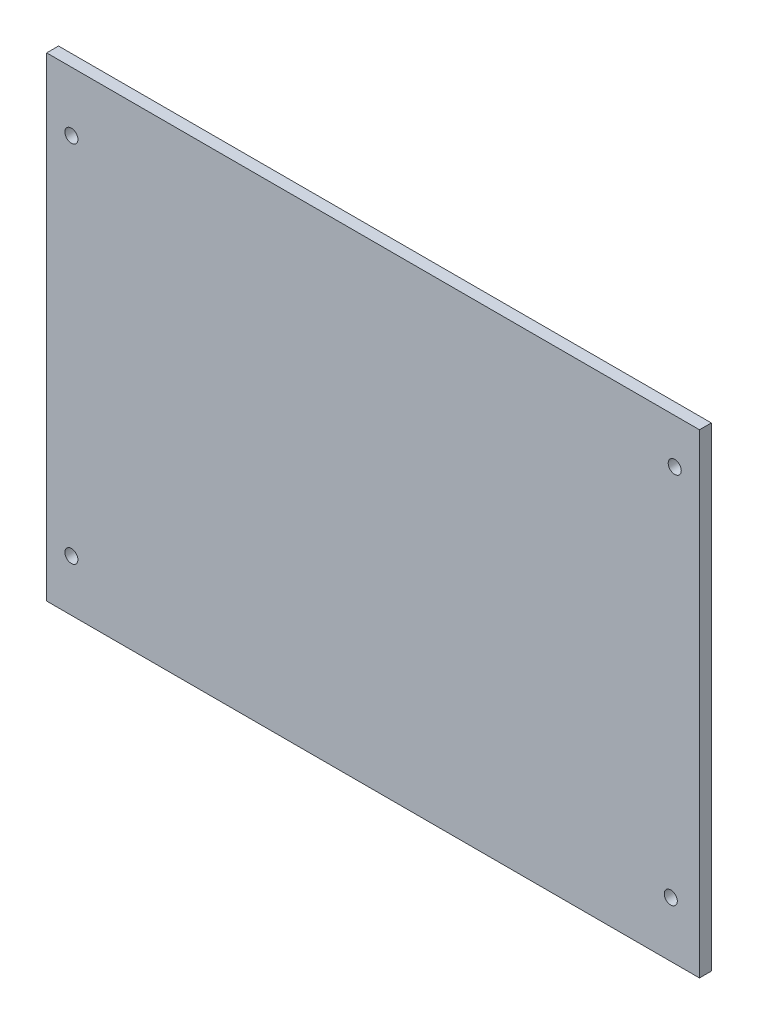
ISO-10303-21;
HEADER;
FILE_DESCRIPTION(('STEP AP214'),'2;1');
FILE_NAME('part.step','',(''),(''),'','','');
FILE_SCHEMA(('AUTOMOTIVE_DESIGN { 1 0 10303 214 1 1 1 1 }'));
ENDSEC;
DATA;
#1=APPLICATION_CONTEXT('core data for automotive mechanical design processes');
#2=APPLICATION_PROTOCOL_DEFINITION('international standard','automotive_design',2000,#1);
#3=PRODUCT_CONTEXT('',#1,'mechanical');
#4=PRODUCT('Part','Part','',(#3));
#5=PRODUCT_RELATED_PRODUCT_CATEGORY('part','',(#4));
#6=PRODUCT_DEFINITION_FORMATION('','',#4);
#7=PRODUCT_DEFINITION_CONTEXT('part definition',#1,'design');
#8=PRODUCT_DEFINITION('design','',#6,#7);
#9=PRODUCT_DEFINITION_SHAPE('','',#8);
#10=(LENGTH_UNIT() NAMED_UNIT(*) SI_UNIT(.MILLI.,.METRE.));
#11=(NAMED_UNIT(*) PLANE_ANGLE_UNIT() SI_UNIT($,.RADIAN.));
#12=(NAMED_UNIT(*) SI_UNIT($,.STERADIAN.) SOLID_ANGLE_UNIT());
#13=UNCERTAINTY_MEASURE_WITH_UNIT(LENGTH_MEASURE(1.E-05),#10,'distance_accuracy_value','');
#14=(GEOMETRIC_REPRESENTATION_CONTEXT(3) GLOBAL_UNCERTAINTY_ASSIGNED_CONTEXT((#13)) GLOBAL_UNIT_ASSIGNED_CONTEXT((#10,
#11,#12)) REPRESENTATION_CONTEXT('',''));
#15=CARTESIAN_POINT('',(0.,0.,0.));
#16=DIRECTION('',(0.,0.,1.));
#17=DIRECTION('',(1.,0.,0.));
#18=AXIS2_PLACEMENT_3D('',#15,#16,#17);
#19=CARTESIAN_POINT('',(0.,0.,6.));
#20=DIRECTION('',(0.,0.,1.));
#21=DIRECTION('',(1.,0.,0.));
#22=AXIS2_PLACEMENT_3D('',#19,#20,#21);
#23=PLANE('',#22);
#24=CARTESIAN_POINT('',(317.493399268037,-22.5,6.));
#25=DIRECTION('',(0.,0.,1.));
#26=DIRECTION('',(1.,0.,0.));
#27=AXIS2_PLACEMENT_3D('',#24,#25,#26);
#28=CIRCLE('',#27,3.30000000000003);
#29=CARTESIAN_POINT('',(320.793399268037,-22.5,6.));
#30=VERTEX_POINT('',#29);
#31=EDGE_CURVE('E123',#30,#30,#28,.T.);
#32=ORIENTED_EDGE('',*,*,#31,.F.);
#33=EDGE_LOOP('',(#32));
#34=FACE_BOUND('',#33,.T.);
#35=CARTESIAN_POINT('',(12.5,-30.,6.));
#36=DIRECTION('',(0.,0.,1.));
#37=DIRECTION('',(1.,0.,0.));
#38=AXIS2_PLACEMENT_3D('',#35,#36,#37);
#39=CIRCLE('',#38,3.3);
#40=CARTESIAN_POINT('',(15.8,-30.,6.));
#41=VERTEX_POINT('',#40);
#42=EDGE_CURVE('E102',#41,#41,#39,.T.);
#43=ORIENTED_EDGE('',*,*,#42,.F.);
#44=EDGE_LOOP('',(#43));
#45=FACE_BOUND('',#44,.T.);
#46=DIRECTION('',(0.,-1.,0.));
#47=VECTOR('',#46,1.);
#48=CARTESIAN_POINT('',(0.,0.,6.));
#49=LINE('',#48,#47);
#50=CARTESIAN_POINT('',(0.,0.,6.));
#51=VERTEX_POINT('',#50);
#52=CARTESIAN_POINT('',(0.,-240.,6.));
#53=VERTEX_POINT('',#52);
#54=EDGE_CURVE('E87',#51,#53,#49,.T.);
#55=ORIENTED_EDGE('',*,*,#54,.T.);
#56=DIRECTION('',(1.,0.,0.));
#57=VECTOR('',#56,1.);
#58=CARTESIAN_POINT('',(0.,-240.,6.));
#59=LINE('',#58,#57);
#60=CARTESIAN_POINT('',(330.,-240.,6.));
#61=VERTEX_POINT('',#60);
#62=EDGE_CURVE('E82',#53,#61,#59,.T.);
#63=ORIENTED_EDGE('',*,*,#62,.T.);
#64=DIRECTION('',(0.,1.,0.));
#65=VECTOR('',#64,1.);
#66=CARTESIAN_POINT('',(330.,0.,6.));
#67=LINE('',#66,#65);
#68=CARTESIAN_POINT('',(330.,0.,6.));
#69=VERTEX_POINT('',#68);
#70=EDGE_CURVE('E85',#61,#69,#67,.T.);
#71=ORIENTED_EDGE('',*,*,#70,.T.);
#72=DIRECTION('',(-1.,0.,0.));
#73=VECTOR('',#72,1.);
#74=CARTESIAN_POINT('',(0.,0.,6.));
#75=LINE('',#74,#73);
#76=EDGE_CURVE('E52',#69,#51,#75,.T.);
#77=ORIENTED_EDGE('',*,*,#76,.T.);
#78=EDGE_LOOP('',(#55,#63,#71,#77));
#79=FACE_BOUND('',#78,.T.);
#80=CARTESIAN_POINT('',(315.493399268037,-212.,6.));
#81=DIRECTION('',(0.,0.,1.));
#82=DIRECTION('',(1.,0.,0.));
#83=AXIS2_PLACEMENT_3D('',#80,#81,#82);
#84=CIRCLE('',#83,3.30000000000003);
#85=CARTESIAN_POINT('',(318.793399268037,-212.,6.));
#86=VERTEX_POINT('',#85);
#87=EDGE_CURVE('E117',#86,#86,#84,.T.);
#88=ORIENTED_EDGE('',*,*,#87,.F.);
#89=EDGE_LOOP('',(#88));
#90=FACE_BOUND('',#89,.T.);
#91=CARTESIAN_POINT('',(12.5,-214.,6.));
#92=DIRECTION('',(0.,0.,1.));
#93=DIRECTION('',(1.,0.,0.));
#94=AXIS2_PLACEMENT_3D('',#91,#92,#93);
#95=CIRCLE('',#94,3.3);
#96=CARTESIAN_POINT('',(15.8,-214.,6.));
#97=VERTEX_POINT('',#96);
#98=EDGE_CURVE('E129',#97,#97,#95,.T.);
#99=ORIENTED_EDGE('',*,*,#98,.F.);
#100=EDGE_LOOP('',(#99));
#101=FACE_BOUND('',#100,.T.);
#102=ADVANCED_FACE('F35',(#34,#45,#79,#90,#101),#23,.T.);
#103=CARTESIAN_POINT('',(0.,0.,0.));
#104=DIRECTION('',(0.,0.,1.));
#105=DIRECTION('',(1.,0.,0.));
#106=AXIS2_PLACEMENT_3D('',#103,#104,#105);
#107=PLANE('',#106);
#108=DIRECTION('',(0.,-1.,0.));
#109=VECTOR('',#108,1.);
#110=CARTESIAN_POINT('',(0.,0.,0.));
#111=LINE('',#110,#109);
#112=CARTESIAN_POINT('',(0.,0.,0.));
#113=VERTEX_POINT('',#112);
#114=CARTESIAN_POINT('',(0.,-240.,0.));
#115=VERTEX_POINT('',#114);
#116=EDGE_CURVE('E99',#113,#115,#111,.T.);
#117=ORIENTED_EDGE('',*,*,#116,.F.);
#118=DIRECTION('',(-1.,0.,0.));
#119=VECTOR('',#118,1.);
#120=CARTESIAN_POINT('',(0.,0.,0.));
#121=LINE('',#120,#119);
#122=CARTESIAN_POINT('',(330.,0.,0.));
#123=VERTEX_POINT('',#122);
#124=EDGE_CURVE('E75',#123,#113,#121,.T.);
#125=ORIENTED_EDGE('',*,*,#124,.F.);
#126=DIRECTION('',(0.,1.,0.));
#127=VECTOR('',#126,1.);
#128=CARTESIAN_POINT('',(330.,0.,0.));
#129=LINE('',#128,#127);
#130=CARTESIAN_POINT('',(330.,-240.,0.));
#131=VERTEX_POINT('',#130);
#132=EDGE_CURVE('E69',#131,#123,#129,.T.);
#133=ORIENTED_EDGE('',*,*,#132,.F.);
#134=DIRECTION('',(1.,0.,0.));
#135=VECTOR('',#134,1.);
#136=CARTESIAN_POINT('',(0.,-240.,0.));
#137=LINE('',#136,#135);
#138=EDGE_CURVE('E91',#115,#131,#137,.T.);
#139=ORIENTED_EDGE('',*,*,#138,.F.);
#140=EDGE_LOOP('',(#117,#125,#133,#139));
#141=FACE_BOUND('',#140,.T.);
#142=CARTESIAN_POINT('',(12.5,-30.,0.));
#143=DIRECTION('',(0.,0.,1.));
#144=DIRECTION('',(1.,0.,0.));
#145=AXIS2_PLACEMENT_3D('',#142,#143,#144);
#146=CIRCLE('',#145,3.3);
#147=CARTESIAN_POINT('',(15.8,-30.,0.));
#148=VERTEX_POINT('',#147);
#149=EDGE_CURVE('E114',#148,#148,#146,.T.);
#150=ORIENTED_EDGE('',*,*,#149,.T.);
#151=EDGE_LOOP('',(#150));
#152=FACE_BOUND('',#151,.T.);
#153=CARTESIAN_POINT('',(315.493399268037,-212.,0.));
#154=DIRECTION('',(0.,0.,1.));
#155=DIRECTION('',(1.,0.,0.));
#156=AXIS2_PLACEMENT_3D('',#153,#154,#155);
#157=CIRCLE('',#156,3.30000000000003);
#158=CARTESIAN_POINT('',(318.793399268037,-212.,0.));
#159=VERTEX_POINT('',#158);
#160=EDGE_CURVE('E120',#159,#159,#157,.T.);
#161=ORIENTED_EDGE('',*,*,#160,.T.);
#162=EDGE_LOOP('',(#161));
#163=FACE_BOUND('',#162,.T.);
#164=CARTESIAN_POINT('',(317.493399268037,-22.5,0.));
#165=DIRECTION('',(0.,0.,1.));
#166=DIRECTION('',(1.,0.,0.));
#167=AXIS2_PLACEMENT_3D('',#164,#165,#166);
#168=CIRCLE('',#167,3.30000000000003);
#169=CARTESIAN_POINT('',(320.793399268037,-22.5,0.));
#170=VERTEX_POINT('',#169);
#171=EDGE_CURVE('E126',#170,#170,#168,.T.);
#172=ORIENTED_EDGE('',*,*,#171,.T.);
#173=EDGE_LOOP('',(#172));
#174=FACE_BOUND('',#173,.T.);
#175=CARTESIAN_POINT('',(12.5,-214.,0.));
#176=DIRECTION('',(0.,0.,1.));
#177=DIRECTION('',(1.,0.,0.));
#178=AXIS2_PLACEMENT_3D('',#175,#176,#177);
#179=CIRCLE('',#178,3.3);
#180=CARTESIAN_POINT('',(15.8,-214.,0.));
#181=VERTEX_POINT('',#180);
#182=EDGE_CURVE('E132',#181,#181,#179,.T.);
#183=ORIENTED_EDGE('',*,*,#182,.T.);
#184=EDGE_LOOP('',(#183));
#185=FACE_BOUND('',#184,.T.);
#186=ADVANCED_FACE('F110',(#141,#152,#163,#174,#185),#107,.F.);
#187=CARTESIAN_POINT('',(0.,0.,6.));
#188=DIRECTION('',(1.,0.,0.));
#189=DIRECTION('',(0.,1.,0.));
#190=AXIS2_PLACEMENT_3D('',#187,#188,#189);
#191=PLANE('',#190);
#192=ORIENTED_EDGE('',*,*,#116,.T.);
#193=DIRECTION('',(0.,0.,-1.));
#194=VECTOR('',#193,1.);
#195=CARTESIAN_POINT('',(0.,-240.,6.));
#196=LINE('',#195,#194);
#197=EDGE_CURVE('E11',#53,#115,#196,.T.);
#198=ORIENTED_EDGE('',*,*,#197,.F.);
#199=ORIENTED_EDGE('',*,*,#54,.F.);
#200=DIRECTION('',(0.,0.,-1.));
#201=VECTOR('',#200,1.);
#202=CARTESIAN_POINT('',(0.,0.,6.));
#203=LINE('',#202,#201);
#204=EDGE_CURVE('E95',#51,#113,#203,.T.);
#205=ORIENTED_EDGE('',*,*,#204,.T.);
#206=EDGE_LOOP('',(#192,#198,#199,#205));
#207=FACE_BOUND('',#206,.T.);
#208=ADVANCED_FACE('F37',(#207),#191,.F.);
#209=CARTESIAN_POINT('',(0.,-240.,6.));
#210=DIRECTION('',(0.,1.,0.));
#211=DIRECTION('',(0.,0.,1.));
#212=AXIS2_PLACEMENT_3D('',#209,#210,#211);
#213=PLANE('',#212);
#214=ORIENTED_EDGE('',*,*,#138,.T.);
#215=DIRECTION('',(0.,0.,-1.));
#216=VECTOR('',#215,1.);
#217=CARTESIAN_POINT('',(330.,-240.,6.));
#218=LINE('',#217,#216);
#219=EDGE_CURVE('E44',#61,#131,#218,.T.);
#220=ORIENTED_EDGE('',*,*,#219,.F.);
#221=ORIENTED_EDGE('',*,*,#62,.F.);
#222=ORIENTED_EDGE('',*,*,#197,.T.);
#223=EDGE_LOOP('',(#214,#220,#221,#222));
#224=FACE_BOUND('',#223,.T.);
#225=ADVANCED_FACE('F90',(#224),#213,.F.);
#226=CARTESIAN_POINT('',(330.,0.,6.));
#227=DIRECTION('',(-1.,0.,0.));
#228=DIRECTION('',(0.,-1.,0.));
#229=AXIS2_PLACEMENT_3D('',#226,#227,#228);
#230=PLANE('',#229);
#231=ORIENTED_EDGE('',*,*,#132,.T.);
#232=DIRECTION('',(0.,0.,-1.));
#233=VECTOR('',#232,1.);
#234=CARTESIAN_POINT('',(330.,0.,6.));
#235=LINE('',#234,#233);
#236=EDGE_CURVE('E92',#69,#123,#235,.T.);
#237=ORIENTED_EDGE('',*,*,#236,.F.);
#238=ORIENTED_EDGE('',*,*,#70,.F.);
#239=ORIENTED_EDGE('',*,*,#219,.T.);
#240=EDGE_LOOP('',(#231,#237,#238,#239));
#241=FACE_BOUND('',#240,.T.);
#242=ADVANCED_FACE('F93',(#241),#230,.F.);
#243=CARTESIAN_POINT('',(0.,0.,6.));
#244=DIRECTION('',(0.,-1.,0.));
#245=DIRECTION('',(0.,0.,-1.));
#246=AXIS2_PLACEMENT_3D('',#243,#244,#245);
#247=PLANE('',#246);
#248=ORIENTED_EDGE('',*,*,#124,.T.);
#249=ORIENTED_EDGE('',*,*,#204,.F.);
#250=ORIENTED_EDGE('',*,*,#76,.F.);
#251=ORIENTED_EDGE('',*,*,#236,.T.);
#252=EDGE_LOOP('',(#248,#249,#250,#251));
#253=FACE_BOUND('',#252,.T.);
#254=ADVANCED_FACE('F107',(#253),#247,.F.);
#255=CARTESIAN_POINT('',(12.5,-30.,6.));
#256=DIRECTION('',(0.,0.,-1.));
#257=DIRECTION('',(-1.,0.,0.));
#258=AXIS2_PLACEMENT_3D('',#255,#256,#257);
#259=CYLINDRICAL_SURFACE('',#258,3.3);
#260=ORIENTED_EDGE('',*,*,#42,.T.);
#261=EDGE_LOOP('',(#260));
#262=FACE_BOUND('',#261,.T.);
#263=ORIENTED_EDGE('',*,*,#149,.F.);
#264=EDGE_LOOP('',(#263));
#265=FACE_BOUND('',#264,.T.);
#266=ADVANCED_FACE('F151',(#262,#265),#259,.F.);
#267=CARTESIAN_POINT('',(315.493399268037,-212.,6.));
#268=DIRECTION('',(0.,0.,-1.));
#269=DIRECTION('',(-1.,0.,0.));
#270=AXIS2_PLACEMENT_3D('',#267,#268,#269);
#271=CYLINDRICAL_SURFACE('',#270,3.30000000000003);
#272=ORIENTED_EDGE('',*,*,#87,.T.);
#273=EDGE_LOOP('',(#272));
#274=FACE_BOUND('',#273,.T.);
#275=ORIENTED_EDGE('',*,*,#160,.F.);
#276=EDGE_LOOP('',(#275));
#277=FACE_BOUND('',#276,.T.);
#278=ADVANCED_FACE('F197',(#274,#277),#271,.F.);
#279=CARTESIAN_POINT('',(317.493399268037,-22.5,6.));
#280=DIRECTION('',(0.,0.,-1.));
#281=DIRECTION('',(-1.,0.,0.));
#282=AXIS2_PLACEMENT_3D('',#279,#280,#281);
#283=CYLINDRICAL_SURFACE('',#282,3.30000000000003);
#284=ORIENTED_EDGE('',*,*,#31,.T.);
#285=EDGE_LOOP('',(#284));
#286=FACE_BOUND('',#285,.T.);
#287=ORIENTED_EDGE('',*,*,#171,.F.);
#288=EDGE_LOOP('',(#287));
#289=FACE_BOUND('',#288,.T.);
#290=ADVANCED_FACE('F205',(#286,#289),#283,.F.);
#291=CARTESIAN_POINT('',(12.5,-214.,6.));
#292=DIRECTION('',(0.,0.,-1.));
#293=DIRECTION('',(-1.,0.,0.));
#294=AXIS2_PLACEMENT_3D('',#291,#292,#293);
#295=CYLINDRICAL_SURFACE('',#294,3.3);
#296=ORIENTED_EDGE('',*,*,#98,.T.);
#297=EDGE_LOOP('',(#296));
#298=FACE_BOUND('',#297,.T.);
#299=ORIENTED_EDGE('',*,*,#182,.F.);
#300=EDGE_LOOP('',(#299));
#301=FACE_BOUND('',#300,.T.);
#302=ADVANCED_FACE('F138',(#298,#301),#295,.F.);
#303=CLOSED_SHELL('',(#102,#186,#208,#225,#242,#254,#266,#278,#290,#302));
#304=MANIFOLD_SOLID_BREP('B2',#303);
#305=ADVANCED_BREP_SHAPE_REPRESENTATION('',(#18,#304),#14);
#306=SHAPE_DEFINITION_REPRESENTATION(#9,#305);
ENDSEC;
END-ISO-10303-21;
